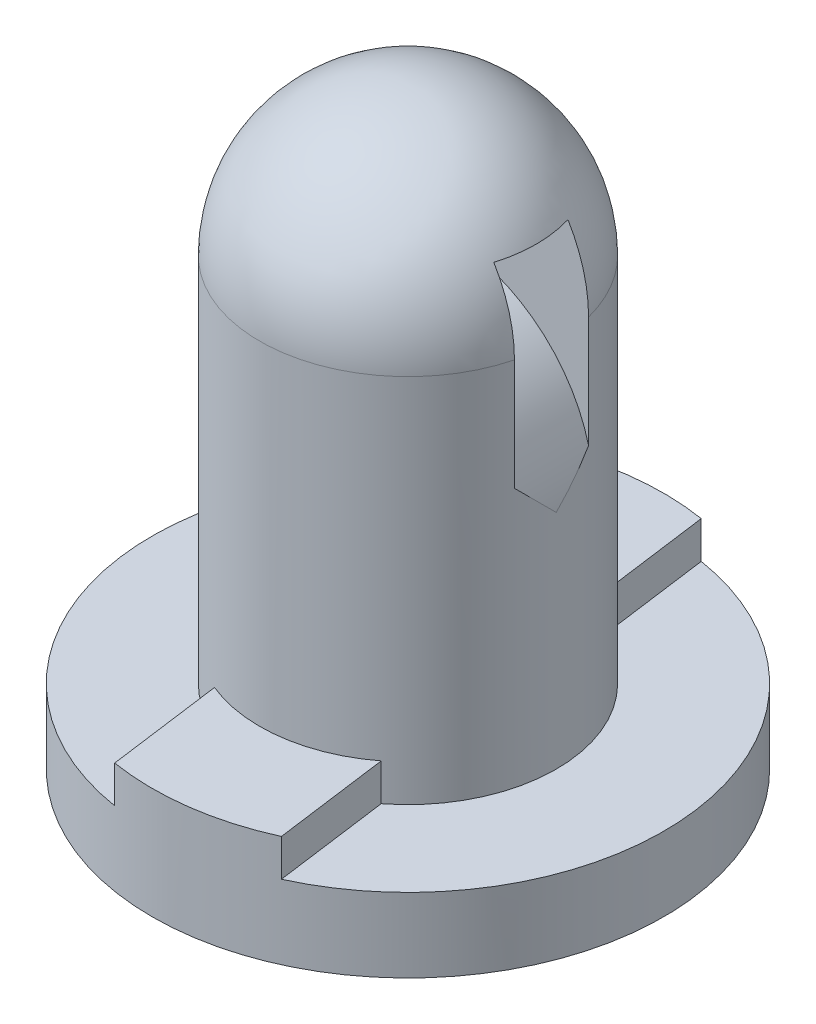
ISO-10303-21;
HEADER;
FILE_DESCRIPTION(('STEP AP214'),'2;1');
FILE_NAME('part.step','',(''),(''),'','','');
FILE_SCHEMA(('AUTOMOTIVE_DESIGN { 1 0 10303 214 1 1 1 1 }'));
ENDSEC;
DATA;
#1=APPLICATION_CONTEXT('core data for automotive mechanical design processes');
#2=APPLICATION_PROTOCOL_DEFINITION('international standard','automotive_design',2000,#1);
#3=PRODUCT_CONTEXT('',#1,'mechanical');
#4=PRODUCT('Part','Part','',(#3));
#5=PRODUCT_RELATED_PRODUCT_CATEGORY('part','',(#4));
#6=PRODUCT_DEFINITION_FORMATION('','',#4);
#7=PRODUCT_DEFINITION_CONTEXT('part definition',#1,'design');
#8=PRODUCT_DEFINITION('design','',#6,#7);
#9=PRODUCT_DEFINITION_SHAPE('','',#8);
#10=(LENGTH_UNIT() NAMED_UNIT(*) SI_UNIT(.MILLI.,.METRE.));
#11=(NAMED_UNIT(*) PLANE_ANGLE_UNIT() SI_UNIT($,.RADIAN.));
#12=(NAMED_UNIT(*) SI_UNIT($,.STERADIAN.) SOLID_ANGLE_UNIT());
#13=UNCERTAINTY_MEASURE_WITH_UNIT(LENGTH_MEASURE(1.E-05),#10,'distance_accuracy_value','');
#14=(GEOMETRIC_REPRESENTATION_CONTEXT(3) GLOBAL_UNCERTAINTY_ASSIGNED_CONTEXT((#13)) GLOBAL_UNIT_ASSIGNED_CONTEXT((#10,
#11,#12)) REPRESENTATION_CONTEXT('',''));
#15=CARTESIAN_POINT('',(0.,0.,0.));
#16=DIRECTION('',(0.,0.,1.));
#17=DIRECTION('',(1.,0.,0.));
#18=AXIS2_PLACEMENT_3D('',#15,#16,#17);
#19=CARTESIAN_POINT('',(0.,6.,0.));
#20=DIRECTION('',(0.,-1.,0.));
#21=DIRECTION('',(0.,0.,-1.));
#22=AXIS2_PLACEMENT_3D('',#19,#20,#21);
#23=CYLINDRICAL_SURFACE('',#22,2.);
#24=DIRECTION('',(0.,-1.,0.));
#25=VECTOR('',#24,1.);
#26=CARTESIAN_POINT('',(1.93649167310371,6.,-0.5));
#27=LINE('',#26,#25);
#28=CARTESIAN_POINT('',(1.93649167310371,6.,-0.5));
#29=VERTEX_POINT('',#28);
#30=CARTESIAN_POINT('',(1.93649167310371,4.5,-0.5));
#31=VERTEX_POINT('',#30);
#32=EDGE_CURVE('E220',#29,#31,#27,.T.);
#33=ORIENTED_EDGE('',*,*,#32,.T.);
#34=CARTESIAN_POINT('',(0.,4.,0.));
#35=DIRECTION('',(0.,-0.707106781186547,-0.707106781186547));
#36=DIRECTION('',(0.,-0.707106781186547,0.707106781186547));
#37=AXIS2_PLACEMENT_3D('',#34,#35,#36);
#38=ELLIPSE('',#37,2.82842712474619,2.);
#39=CARTESIAN_POINT('',(2.,4.,0.));
#40=VERTEX_POINT('',#39);
#41=EDGE_CURVE('E265',#31,#40,#38,.T.);
#42=ORIENTED_EDGE('',*,*,#41,.T.);
#43=CARTESIAN_POINT('',(0.,4.,0.));
#44=DIRECTION('',(0.,-0.707106781186547,0.707106781186547));
#45=DIRECTION('',(0.,-0.707106781186547,-0.707106781186547));
#46=AXIS2_PLACEMENT_3D('',#43,#44,#45);
#47=ELLIPSE('',#46,2.82842712474619,2.);
#48=CARTESIAN_POINT('',(1.93649167310371,4.5,0.5));
#49=VERTEX_POINT('',#48);
#50=EDGE_CURVE('E260',#40,#49,#47,.T.);
#51=ORIENTED_EDGE('',*,*,#50,.T.);
#52=DIRECTION('',(0.,-1.,0.));
#53=VECTOR('',#52,1.);
#54=CARTESIAN_POINT('',(1.93649167310371,6.,0.5));
#55=LINE('',#54,#53);
#56=CARTESIAN_POINT('',(1.93649167310371,6.,0.5));
#57=VERTEX_POINT('',#56);
#58=EDGE_CURVE('E213',#57,#49,#55,.T.);
#59=ORIENTED_EDGE('',*,*,#58,.F.);
#60=CARTESIAN_POINT('',(0.,6.,0.));
#61=DIRECTION('',(0.,1.,0.));
#62=DIRECTION('',(0.,0.,1.));
#63=AXIS2_PLACEMENT_3D('',#60,#61,#62);
#64=CIRCLE('',#63,2.);
#65=CARTESIAN_POINT('',(-1.93649167310371,6.,0.5));
#66=VERTEX_POINT('',#65);
#67=EDGE_CURVE('E224',#66,#57,#64,.T.);
#68=ORIENTED_EDGE('',*,*,#67,.F.);
#69=DIRECTION('',(0.,-1.,0.));
#70=VECTOR('',#69,1.);
#71=CARTESIAN_POINT('',(-1.93649167310371,6.,0.5));
#72=LINE('',#71,#70);
#73=CARTESIAN_POINT('',(-1.93649167310371,4.5,0.5));
#74=VERTEX_POINT('',#73);
#75=EDGE_CURVE('E204',#74,#66,#72,.F.);
#76=ORIENTED_EDGE('',*,*,#75,.F.);
#77=CARTESIAN_POINT('',(-2.,4.,0.));
#78=VERTEX_POINT('',#77);
#79=EDGE_CURVE('E256',#74,#78,#47,.T.);
#80=ORIENTED_EDGE('',*,*,#79,.T.);
#81=CARTESIAN_POINT('',(-1.93649167310371,4.5,-0.5));
#82=VERTEX_POINT('',#81);
#83=EDGE_CURVE('E261',#78,#82,#38,.T.);
#84=ORIENTED_EDGE('',*,*,#83,.T.);
#85=DIRECTION('',(0.,-1.,0.));
#86=VECTOR('',#85,1.);
#87=CARTESIAN_POINT('',(-1.93649167310371,6.,-0.5));
#88=LINE('',#87,#86);
#89=CARTESIAN_POINT('',(-1.93649167310371,6.,-0.5));
#90=VERTEX_POINT('',#89);
#91=EDGE_CURVE('E216',#82,#90,#88,.F.);
#92=ORIENTED_EDGE('',*,*,#91,.T.);
#93=EDGE_CURVE('E228',#29,#90,#64,.T.);
#94=ORIENTED_EDGE('',*,*,#93,.F.);
#95=EDGE_LOOP('',(#33,#42,#51,#59,#68,#76,#80,#84,#92,#94));
#96=FACE_BOUND('',#95,.T.);
#97=DIRECTION('',(0.,-1.,0.));
#98=VECTOR('',#97,1.);
#99=CARTESIAN_POINT('',(-0.759803367864858,6.,1.85005374034951));
#100=LINE('',#99,#98);
#101=CARTESIAN_POINT('',(-0.759803367864859,1.5,1.85005374034951));
#102=VERTEX_POINT('',#101);
#103=CARTESIAN_POINT('',(-0.759803367864858,1.,1.85005374034951));
#104=VERTEX_POINT('',#103);
#105=EDGE_CURVE('E191',#102,#104,#100,.T.);
#106=ORIENTED_EDGE('',*,*,#105,.F.);
#107=CARTESIAN_POINT('',(0.,1.5,0.));
#108=DIRECTION('',(0.,-1.,0.));
#109=DIRECTION('',(0.,0.,-1.));
#110=AXIS2_PLACEMENT_3D('',#107,#108,#109);
#111=CIRCLE('',#110,2.);
#112=CARTESIAN_POINT('',(1.22229185357667,1.5,1.5830358886267));
#113=VERTEX_POINT('',#112);
#114=EDGE_CURVE('E11',#113,#102,#111,.T.);
#115=ORIENTED_EDGE('',*,*,#114,.F.);
#116=DIRECTION('',(0.,-1.,0.));
#117=VECTOR('',#116,1.);
#118=CARTESIAN_POINT('',(1.22229185357667,6.,1.5830358886267));
#119=LINE('',#118,#117);
#120=CARTESIAN_POINT('',(1.22229185357667,1.,1.5830358886267));
#121=VERTEX_POINT('',#120);
#122=EDGE_CURVE('E178',#121,#113,#119,.F.);
#123=ORIENTED_EDGE('',*,*,#122,.F.);
#124=CARTESIAN_POINT('',(0.,1.,0.));
#125=DIRECTION('',(0.,1.,0.));
#126=DIRECTION('',(0.,0.,1.));
#127=AXIS2_PLACEMENT_3D('',#124,#125,#126);
#128=CIRCLE('',#127,2.);
#129=CARTESIAN_POINT('',(0.759803367864858,1.,-1.85005374034951));
#130=VERTEX_POINT('',#129);
#131=EDGE_CURVE('E229',#121,#130,#128,.T.);
#132=ORIENTED_EDGE('',*,*,#131,.T.);
#133=DIRECTION('',(0.,-1.,0.));
#134=VECTOR('',#133,1.);
#135=CARTESIAN_POINT('',(0.759803367864858,6.,-1.85005374034951));
#136=LINE('',#135,#134);
#137=CARTESIAN_POINT('',(0.759803367864858,1.5,-1.85005374034951));
#138=VERTEX_POINT('',#137);
#139=EDGE_CURVE('E63',#138,#130,#136,.T.);
#140=ORIENTED_EDGE('',*,*,#139,.F.);
#141=CARTESIAN_POINT('',(-1.22229185357667,1.5,-1.5830358886267));
#142=VERTEX_POINT('',#141);
#143=EDGE_CURVE('E43',#142,#138,#111,.T.);
#144=ORIENTED_EDGE('',*,*,#143,.F.);
#145=DIRECTION('',(0.,-1.,0.));
#146=VECTOR('',#145,1.);
#147=CARTESIAN_POINT('',(-1.22229185357667,6.,-1.5830358886267));
#148=LINE('',#147,#146);
#149=CARTESIAN_POINT('',(-1.22229185357667,1.,-1.58303588862669));
#150=VERTEX_POINT('',#149);
#151=EDGE_CURVE('E154',#150,#142,#148,.F.);
#152=ORIENTED_EDGE('',*,*,#151,.F.);
#153=EDGE_CURVE('E234',#150,#104,#128,.T.);
#154=ORIENTED_EDGE('',*,*,#153,.T.);
#155=EDGE_LOOP('',(#106,#115,#123,#132,#140,#144,#152,#154));
#156=FACE_BOUND('',#155,.T.);
#157=ADVANCED_FACE('F39',(#96,#156),#23,.T.);
#158=CARTESIAN_POINT('',(0.,1.,0.));
#159=DIRECTION('',(0.,1.,0.));
#160=DIRECTION('',(0.,0.,1.));
#161=AXIS2_PLACEMENT_3D('',#158,#159,#160);
#162=PLANE('',#161);
#163=CARTESIAN_POINT('',(0.,1.,0.));
#164=DIRECTION('',(0.,1.,0.));
#165=DIRECTION('',(0.,0.,1.));
#166=AXIS2_PLACEMENT_3D('',#163,#164,#165);
#167=CIRCLE('',#166,3.45);
#168=CARTESIAN_POINT('',(-1.43187985135895,1.,-3.1388246353169));
#169=VERTEX_POINT('',#168);
#170=CARTESIAN_POINT('',(-0.55021537008258,1.,3.40584248703972));
#171=VERTEX_POINT('',#170);
#172=EDGE_CURVE('E176',#169,#171,#167,.T.);
#173=ORIENTED_EDGE('',*,*,#172,.T.);
#174=DIRECTION('',(-0.133508925861408,0.,-0.991047610720763));
#175=VECTOR('',#174,1.);
#176=CARTESIAN_POINT('',(-0.991047610720764,1.,0.133508925861408));
#177=LINE('',#176,#175);
#178=EDGE_CURVE('E268',#171,#104,#177,.T.);
#179=ORIENTED_EDGE('',*,*,#178,.T.);
#180=ORIENTED_EDGE('',*,*,#153,.F.);
#181=DIRECTION('',(0.133508925861408,0.,0.991047610720763));
#182=VECTOR('',#181,1.);
#183=CARTESIAN_POINT('',(-1.43187985135895,1.,-3.1388246353169));
#184=LINE('',#183,#182);
#185=EDGE_CURVE('E295',#169,#150,#184,.T.);
#186=ORIENTED_EDGE('',*,*,#185,.F.);
#187=EDGE_LOOP('',(#173,#179,#180,#186));
#188=FACE_BOUND('',#187,.T.);
#189=ADVANCED_FACE('F321',(#188),#162,.T.);
#190=CARTESIAN_POINT('',(1.43187985135895,1.,3.1388246353169));
#191=VERTEX_POINT('',#190);
#192=CARTESIAN_POINT('',(0.550215370082579,1.,-3.40584248703972));
#193=VERTEX_POINT('',#192);
#194=EDGE_CURVE('E235',#191,#193,#167,.T.);
#195=ORIENTED_EDGE('',*,*,#194,.T.);
#196=DIRECTION('',(0.133508925861408,0.,0.991047610720763));
#197=VECTOR('',#196,1.);
#198=CARTESIAN_POINT('',(0.991047610720763,1.,-0.133508925861408));
#199=LINE('',#198,#197);
#200=EDGE_CURVE('E266',#193,#130,#199,.T.);
#201=ORIENTED_EDGE('',*,*,#200,.T.);
#202=ORIENTED_EDGE('',*,*,#131,.F.);
#203=DIRECTION('',(-0.133508925861408,0.,-0.991047610720763));
#204=VECTOR('',#203,1.);
#205=CARTESIAN_POINT('',(0.550215370082579,1.,-3.40584248703972));
#206=LINE('',#205,#204);
#207=EDGE_CURVE('E169',#191,#121,#206,.T.);
#208=ORIENTED_EDGE('',*,*,#207,.F.);
#209=EDGE_LOOP('',(#195,#201,#202,#208));
#210=FACE_BOUND('',#209,.T.);
#211=ADVANCED_FACE('F286',(#210),#162,.T.);
#212=CARTESIAN_POINT('',(0.,1.,0.));
#213=DIRECTION('',(0.,-1.,0.));
#214=DIRECTION('',(0.,0.,-1.));
#215=AXIS2_PLACEMENT_3D('',#212,#213,#214);
#216=CYLINDRICAL_SURFACE('',#215,3.45);
#217=ORIENTED_EDGE('',*,*,#194,.F.);
#218=DIRECTION('',(0.,-1.,0.));
#219=VECTOR('',#218,1.);
#220=CARTESIAN_POINT('',(1.43187985135895,1.5,3.1388246353169));
#221=LINE('',#220,#219);
#222=CARTESIAN_POINT('',(1.43187985135895,1.5,3.1388246353169));
#223=VERTEX_POINT('',#222);
#224=EDGE_CURVE('E55',#223,#191,#221,.T.);
#225=ORIENTED_EDGE('',*,*,#224,.F.);
#226=CARTESIAN_POINT('',(0.,1.5,0.));
#227=DIRECTION('',(0.,1.,0.));
#228=DIRECTION('',(0.,0.,1.));
#229=AXIS2_PLACEMENT_3D('',#226,#227,#228);
#230=CIRCLE('',#229,3.45);
#231=CARTESIAN_POINT('',(-0.55021537008258,1.5,3.40584248703972));
#232=VERTEX_POINT('',#231);
#233=EDGE_CURVE('E158',#232,#223,#230,.T.);
#234=ORIENTED_EDGE('',*,*,#233,.F.);
#235=DIRECTION('',(0.,-1.,0.));
#236=VECTOR('',#235,1.);
#237=CARTESIAN_POINT('',(-0.55021537008258,1.5,3.40584248703972));
#238=LINE('',#237,#236);
#239=EDGE_CURVE('E179',#232,#171,#238,.T.);
#240=ORIENTED_EDGE('',*,*,#239,.T.);
#241=ORIENTED_EDGE('',*,*,#172,.F.);
#242=DIRECTION('',(0.,-1.,0.));
#243=VECTOR('',#242,1.);
#244=CARTESIAN_POINT('',(-1.43187985135895,1.5,-3.1388246353169));
#245=LINE('',#244,#243);
#246=CARTESIAN_POINT('',(-1.43187985135895,1.5,-3.1388246353169));
#247=VERTEX_POINT('',#246);
#248=EDGE_CURVE('E151',#247,#169,#245,.T.);
#249=ORIENTED_EDGE('',*,*,#248,.F.);
#250=CARTESIAN_POINT('',(0.,1.5,0.));
#251=DIRECTION('',(0.,1.,0.));
#252=DIRECTION('',(0.,0.,-1.));
#253=AXIS2_PLACEMENT_3D('',#250,#251,#252);
#254=CIRCLE('',#253,3.45);
#255=CARTESIAN_POINT('',(0.550215370082579,1.5,-3.40584248703972));
#256=VERTEX_POINT('',#255);
#257=EDGE_CURVE('E162',#256,#247,#254,.T.);
#258=ORIENTED_EDGE('',*,*,#257,.F.);
#259=DIRECTION('',(0.,-1.,0.));
#260=VECTOR('',#259,1.);
#261=CARTESIAN_POINT('',(0.550215370082579,1.5,-3.40584248703972));
#262=LINE('',#261,#260);
#263=EDGE_CURVE('E277',#256,#193,#262,.T.);
#264=ORIENTED_EDGE('',*,*,#263,.T.);
#265=EDGE_LOOP('',(#217,#225,#234,#240,#241,#249,#258,#264));
#266=FACE_BOUND('',#265,.T.);
#267=CARTESIAN_POINT('',(0.,0.,0.));
#268=DIRECTION('',(0.,1.,0.));
#269=DIRECTION('',(0.,0.,1.));
#270=AXIS2_PLACEMENT_3D('',#267,#268,#269);
#271=CIRCLE('',#270,3.45);
#272=CARTESIAN_POINT('',(0.,0.,3.45));
#273=VERTEX_POINT('',#272);
#274=EDGE_CURVE('E239',#273,#273,#271,.T.);
#275=ORIENTED_EDGE('',*,*,#274,.T.);
#276=EDGE_LOOP('',(#275));
#277=FACE_BOUND('',#276,.T.);
#278=ADVANCED_FACE('F41',(#266,#277),#216,.T.);
#279=CARTESIAN_POINT('',(0.,0.,0.));
#280=DIRECTION('',(0.,1.,0.));
#281=DIRECTION('',(0.,0.,1.));
#282=AXIS2_PLACEMENT_3D('',#279,#280,#281);
#283=PLANE('',#282);
#284=ORIENTED_EDGE('',*,*,#274,.F.);
#285=EDGE_LOOP('',(#284));
#286=FACE_BOUND('',#285,.T.);
#287=ADVANCED_FACE('F331',(#286),#283,.F.);
#288=CARTESIAN_POINT('',(0.,6.,0.));
#289=DIRECTION('',(0.,-1.,0.));
#290=DIRECTION('',(0.,0.,-1.));
#291=AXIS2_PLACEMENT_3D('',#288,#289,#290);
#292=SPHERICAL_SURFACE('',#291,2.);
#293=CARTESIAN_POINT('',(0.,7.,0.));
#294=DIRECTION('',(0.,1.,0.));
#295=DIRECTION('',(-1.,0.,0.));
#296=AXIS2_PLACEMENT_3D('',#293,#294,#295);
#297=CIRCLE('',#296,1.73205080756888);
#298=CARTESIAN_POINT('',(1.6583123951777,7.,0.5));
#299=VERTEX_POINT('',#298);
#300=CARTESIAN_POINT('',(1.6583123951777,7.,-0.5));
#301=VERTEX_POINT('',#300);
#302=EDGE_CURVE('E251',#299,#301,#297,.T.);
#303=ORIENTED_EDGE('',*,*,#302,.T.);
#304=CARTESIAN_POINT('',(0.,6.,-0.5));
#305=DIRECTION('',(0.,0.,-1.));
#306=DIRECTION('',(-1.,0.,0.));
#307=AXIS2_PLACEMENT_3D('',#304,#305,#306);
#308=CIRCLE('',#307,1.93649167310371);
#309=EDGE_CURVE('E255',#301,#29,#308,.T.);
#310=ORIENTED_EDGE('',*,*,#309,.T.);
#311=ORIENTED_EDGE('',*,*,#93,.T.);
#312=CARTESIAN_POINT('',(-1.6583123951777,7.,-0.5));
#313=VERTEX_POINT('',#312);
#314=EDGE_CURVE('E250',#90,#313,#308,.T.);
#315=ORIENTED_EDGE('',*,*,#314,.T.);
#316=CARTESIAN_POINT('',(-1.6583123951777,7.,0.5));
#317=VERTEX_POINT('',#316);
#318=EDGE_CURVE('E245',#313,#317,#297,.T.);
#319=ORIENTED_EDGE('',*,*,#318,.T.);
#320=CARTESIAN_POINT('',(0.,6.,0.5));
#321=DIRECTION('',(0.,0.,-1.));
#322=DIRECTION('',(-1.,0.,0.));
#323=AXIS2_PLACEMENT_3D('',#320,#321,#322);
#324=CIRCLE('',#323,1.93649167310371);
#325=EDGE_CURVE('E233',#66,#317,#324,.T.);
#326=ORIENTED_EDGE('',*,*,#325,.F.);
#327=ORIENTED_EDGE('',*,*,#67,.T.);
#328=EDGE_CURVE('E246',#299,#57,#324,.T.);
#329=ORIENTED_EDGE('',*,*,#328,.F.);
#330=EDGE_LOOP('',(#303,#310,#311,#315,#319,#326,#327,#329));
#331=FACE_BOUND('',#330,.T.);
#332=ADVANCED_FACE('F329',(#331),#292,.T.);
#333=CARTESIAN_POINT('',(0.,4.,-0.5));
#334=DIRECTION('',(0.,0.,1.));
#335=DIRECTION('',(1.,0.,0.));
#336=AXIS2_PLACEMENT_3D('',#333,#334,#335);
#337=CYLINDRICAL_SURFACE('',#336,2.);
#338=CARTESIAN_POINT('',(0.,4.,0.5));
#339=DIRECTION('',(0.,0.,-1.));
#340=DIRECTION('',(-1.,0.,0.));
#341=AXIS2_PLACEMENT_3D('',#338,#339,#340);
#342=CIRCLE('',#341,2.);
#343=EDGE_CURVE('E194',#74,#49,#342,.T.);
#344=ORIENTED_EDGE('',*,*,#343,.T.);
#345=ORIENTED_EDGE('',*,*,#50,.F.);
#346=ORIENTED_EDGE('',*,*,#41,.F.);
#347=CARTESIAN_POINT('',(0.,4.,-0.5));
#348=DIRECTION('',(0.,0.,-1.));
#349=DIRECTION('',(-1.,0.,0.));
#350=AXIS2_PLACEMENT_3D('',#347,#348,#349);
#351=CIRCLE('',#350,2.);
#352=EDGE_CURVE('E195',#82,#31,#351,.T.);
#353=ORIENTED_EDGE('',*,*,#352,.F.);
#354=ORIENTED_EDGE('',*,*,#83,.F.);
#355=ORIENTED_EDGE('',*,*,#79,.F.);
#356=EDGE_LOOP('',(#344,#345,#346,#353,#354,#355));
#357=FACE_BOUND('',#356,.T.);
#358=ADVANCED_FACE('F338',(#357),#337,.T.);
#359=CARTESIAN_POINT('',(-2.,7.,-0.5));
#360=DIRECTION('',(0.,1.,0.));
#361=DIRECTION('',(-1.,0.,0.));
#362=AXIS2_PLACEMENT_3D('',#359,#360,#361);
#363=PLANE('',#362);
#364=DIRECTION('',(-1.,0.,0.));
#365=VECTOR('',#364,1.);
#366=CARTESIAN_POINT('',(-2.,7.,0.5));
#367=LINE('',#366,#365);
#368=EDGE_CURVE('E200',#299,#317,#367,.T.);
#369=ORIENTED_EDGE('',*,*,#368,.T.);
#370=ORIENTED_EDGE('',*,*,#318,.F.);
#371=DIRECTION('',(-1.,0.,0.));
#372=VECTOR('',#371,1.);
#373=CARTESIAN_POINT('',(-2.,7.,-0.5));
#374=LINE('',#373,#372);
#375=EDGE_CURVE('E199',#301,#313,#374,.T.);
#376=ORIENTED_EDGE('',*,*,#375,.F.);
#377=ORIENTED_EDGE('',*,*,#302,.F.);
#378=EDGE_LOOP('',(#369,#370,#376,#377));
#379=FACE_BOUND('',#378,.T.);
#380=ADVANCED_FACE('F370',(#379),#363,.F.);
#381=CARTESIAN_POINT('',(0.,4.,-0.5));
#382=DIRECTION('',(0.,0.,-1.));
#383=DIRECTION('',(-1.,0.,0.));
#384=AXIS2_PLACEMENT_3D('',#381,#382,#383);
#385=PLANE('',#384);
#386=ORIENTED_EDGE('',*,*,#309,.F.);
#387=ORIENTED_EDGE('',*,*,#375,.T.);
#388=ORIENTED_EDGE('',*,*,#314,.F.);
#389=ORIENTED_EDGE('',*,*,#91,.F.);
#390=ORIENTED_EDGE('',*,*,#352,.T.);
#391=ORIENTED_EDGE('',*,*,#32,.F.);
#392=EDGE_LOOP('',(#386,#387,#388,#389,#390,#391));
#393=FACE_BOUND('',#392,.T.);
#394=ADVANCED_FACE('F315',(#393),#385,.F.);
#395=CARTESIAN_POINT('',(0.,4.,0.5));
#396=DIRECTION('',(0.,0.,-1.));
#397=DIRECTION('',(-1.,0.,0.));
#398=AXIS2_PLACEMENT_3D('',#395,#396,#397);
#399=PLANE('',#398);
#400=ORIENTED_EDGE('',*,*,#58,.T.);
#401=ORIENTED_EDGE('',*,*,#343,.F.);
#402=ORIENTED_EDGE('',*,*,#75,.T.);
#403=ORIENTED_EDGE('',*,*,#325,.T.);
#404=ORIENTED_EDGE('',*,*,#368,.F.);
#405=ORIENTED_EDGE('',*,*,#328,.T.);
#406=EDGE_LOOP('',(#400,#401,#402,#403,#404,#405));
#407=FACE_BOUND('',#406,.T.);
#408=ADVANCED_FACE('F307',(#407),#399,.T.);
#409=CARTESIAN_POINT('',(0.550215370082579,1.5,-3.40584248703972));
#410=DIRECTION('',(-0.991047610720763,0.,0.133508925861408));
#411=DIRECTION('',(0.133508925861408,0.,0.991047610720763));
#412=AXIS2_PLACEMENT_3D('',#409,#410,#411);
#413=PLANE('',#412);
#414=ORIENTED_EDGE('',*,*,#207,.T.);
#415=ORIENTED_EDGE('',*,*,#122,.T.);
#416=DIRECTION('',(-0.133508925861408,0.,-0.991047610720763));
#417=VECTOR('',#416,1.);
#418=CARTESIAN_POINT('',(0.550215370082579,1.5,-3.40584248703972));
#419=LINE('',#418,#417);
#420=EDGE_CURVE('E279',#223,#113,#419,.T.);
#421=ORIENTED_EDGE('',*,*,#420,.F.);
#422=ORIENTED_EDGE('',*,*,#224,.T.);
#423=EDGE_LOOP('',(#414,#415,#421,#422));
#424=FACE_BOUND('',#423,.T.);
#425=ADVANCED_FACE('F304',(#424),#413,.F.);
#426=CARTESIAN_POINT('',(-1.43187985135895,1.5,-3.1388246353169));
#427=DIRECTION('',(0.991047610720763,0.,-0.133508925861408));
#428=DIRECTION('',(-0.133508925861408,0.,-0.991047610720763));
#429=AXIS2_PLACEMENT_3D('',#426,#427,#428);
#430=PLANE('',#429);
#431=DIRECTION('',(0.133508925861408,0.,0.991047610720763));
#432=VECTOR('',#431,1.);
#433=CARTESIAN_POINT('',(-1.43187985135895,1.5,-3.1388246353169));
#434=LINE('',#433,#432);
#435=EDGE_CURVE('E159',#102,#232,#434,.T.);
#436=ORIENTED_EDGE('',*,*,#435,.F.);
#437=ORIENTED_EDGE('',*,*,#105,.T.);
#438=ORIENTED_EDGE('',*,*,#178,.F.);
#439=ORIENTED_EDGE('',*,*,#239,.F.);
#440=EDGE_LOOP('',(#436,#437,#438,#439));
#441=FACE_BOUND('',#440,.T.);
#442=ADVANCED_FACE('F306',(#441),#430,.F.);
#443=CARTESIAN_POINT('',(0.,1.5,0.));
#444=DIRECTION('',(0.,-1.,0.));
#445=DIRECTION('',(0.,0.,-1.));
#446=AXIS2_PLACEMENT_3D('',#443,#444,#445);
#447=PLANE('',#446);
#448=ORIENTED_EDGE('',*,*,#420,.T.);
#449=ORIENTED_EDGE('',*,*,#114,.T.);
#450=ORIENTED_EDGE('',*,*,#435,.T.);
#451=ORIENTED_EDGE('',*,*,#233,.T.);
#452=EDGE_LOOP('',(#448,#449,#450,#451));
#453=FACE_BOUND('',#452,.T.);
#454=ADVANCED_FACE('F301',(#453),#447,.F.);
#455=ORIENTED_EDGE('',*,*,#185,.T.);
#456=ORIENTED_EDGE('',*,*,#151,.T.);
#457=EDGE_CURVE('E147',#247,#142,#434,.T.);
#458=ORIENTED_EDGE('',*,*,#457,.F.);
#459=ORIENTED_EDGE('',*,*,#248,.T.);
#460=EDGE_LOOP('',(#455,#456,#458,#459));
#461=FACE_BOUND('',#460,.T.);
#462=ADVANCED_FACE('F149',(#461),#430,.F.);
#463=EDGE_CURVE('E164',#138,#256,#419,.T.);
#464=ORIENTED_EDGE('',*,*,#463,.F.);
#465=ORIENTED_EDGE('',*,*,#139,.T.);
#466=ORIENTED_EDGE('',*,*,#200,.F.);
#467=ORIENTED_EDGE('',*,*,#263,.F.);
#468=EDGE_LOOP('',(#464,#465,#466,#467));
#469=FACE_BOUND('',#468,.T.);
#470=ADVANCED_FACE('F276',(#469),#413,.F.);
#471=ORIENTED_EDGE('',*,*,#457,.T.);
#472=ORIENTED_EDGE('',*,*,#143,.T.);
#473=ORIENTED_EDGE('',*,*,#463,.T.);
#474=ORIENTED_EDGE('',*,*,#257,.T.);
#475=EDGE_LOOP('',(#471,#472,#473,#474));
#476=FACE_BOUND('',#475,.T.);
#477=ADVANCED_FACE('F163',(#476),#447,.F.);
#478=CLOSED_SHELL('',(#157,#189,#211,#278,#287,#332,#358,#380,#394,#408,#425,#442,#454,#462,
#470,#477));
#479=MANIFOLD_SOLID_BREP('B2',#478);
#480=ADVANCED_BREP_SHAPE_REPRESENTATION('',(#18,#479),#14);
#481=SHAPE_DEFINITION_REPRESENTATION(#9,#480);
ENDSEC;
END-ISO-10303-21;
